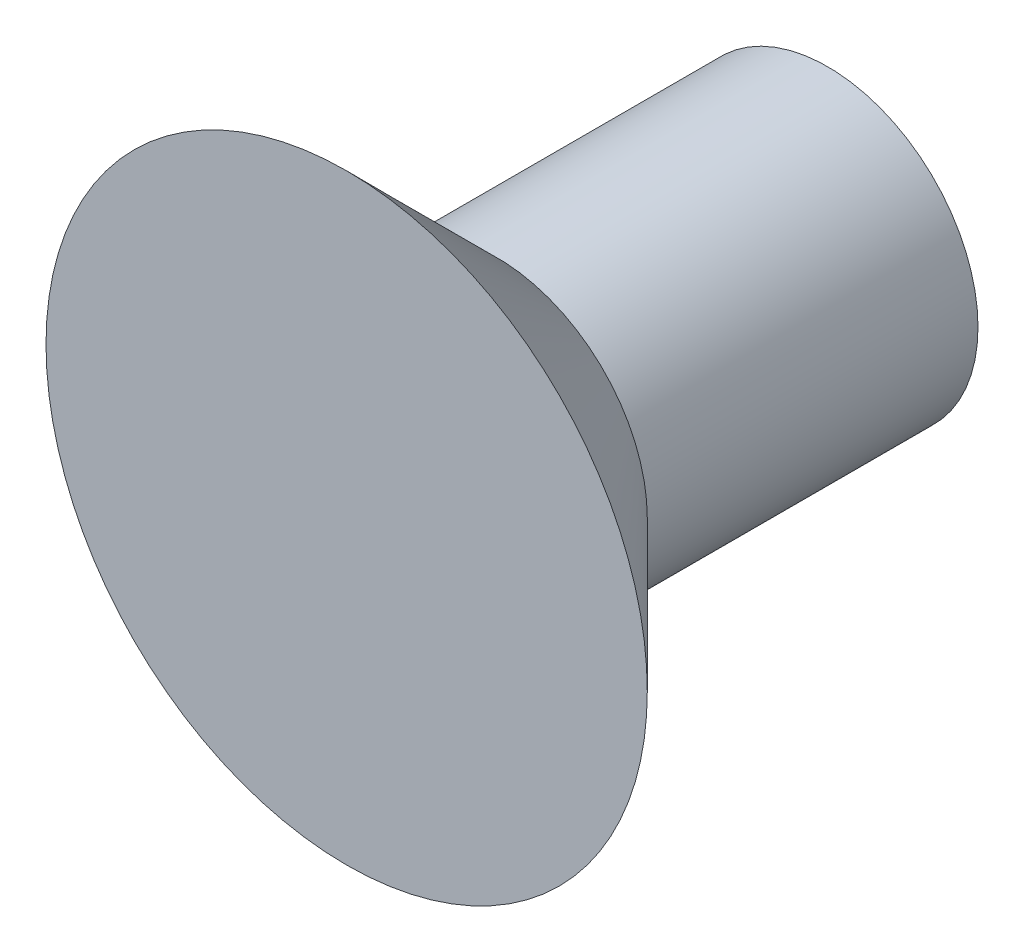
ISO-10303-21;
HEADER;
FILE_DESCRIPTION(('STEP AP214'),'2;1');
FILE_NAME('part.step','',(''),(''),'','','');
FILE_SCHEMA(('AUTOMOTIVE_DESIGN { 1 0 10303 214 1 1 1 1 }'));
ENDSEC;
DATA;
#1=APPLICATION_CONTEXT('core data for automotive mechanical design processes');
#2=APPLICATION_PROTOCOL_DEFINITION('international standard','automotive_design',2000,#1);
#3=PRODUCT_CONTEXT('',#1,'mechanical');
#4=PRODUCT('Part','Part','',(#3));
#5=PRODUCT_RELATED_PRODUCT_CATEGORY('part','',(#4));
#6=PRODUCT_DEFINITION_FORMATION('','',#4);
#7=PRODUCT_DEFINITION_CONTEXT('part definition',#1,'design');
#8=PRODUCT_DEFINITION('design','',#6,#7);
#9=PRODUCT_DEFINITION_SHAPE('','',#8);
#10=(LENGTH_UNIT() NAMED_UNIT(*) SI_UNIT(.MILLI.,.METRE.));
#11=(NAMED_UNIT(*) PLANE_ANGLE_UNIT() SI_UNIT($,.RADIAN.));
#12=(NAMED_UNIT(*) SI_UNIT($,.STERADIAN.) SOLID_ANGLE_UNIT());
#13=UNCERTAINTY_MEASURE_WITH_UNIT(LENGTH_MEASURE(1.E-05),#10,'distance_accuracy_value','');
#14=(GEOMETRIC_REPRESENTATION_CONTEXT(3) GLOBAL_UNCERTAINTY_ASSIGNED_CONTEXT((#13)) GLOBAL_UNIT_ASSIGNED_CONTEXT((#10,
#11,#12)) REPRESENTATION_CONTEXT('',''));
#15=CARTESIAN_POINT('',(0.,0.,0.));
#16=DIRECTION('',(0.,0.,1.));
#17=DIRECTION('',(1.,0.,0.));
#18=AXIS2_PLACEMENT_3D('',#15,#16,#17);
#19=CARTESIAN_POINT('',(0.,0.,0.));
#20=DIRECTION('',(0.,0.,1.));
#21=DIRECTION('',(1.,0.,0.));
#22=AXIS2_PLACEMENT_3D('',#19,#20,#21);
#23=CONICAL_SURFACE('',#22,2.5,0.785398163397448);
#24=CARTESIAN_POINT('',(0.,0.,-1.25));
#25=DIRECTION('',(0.,0.,1.));
#26=DIRECTION('',(1.,0.,0.));
#27=AXIS2_PLACEMENT_3D('',#24,#25,#26);
#28=CIRCLE('',#27,1.25);
#29=CARTESIAN_POINT('',(1.25,0.,-1.25));
#30=VERTEX_POINT('',#29);
#31=EDGE_CURVE('E43',#30,#30,#28,.T.);
#32=ORIENTED_EDGE('',*,*,#31,.T.);
#33=EDGE_LOOP('',(#32));
#34=FACE_BOUND('',#33,.T.);
#35=CARTESIAN_POINT('',(0.,0.,0.));
#36=DIRECTION('',(0.,0.,1.));
#37=DIRECTION('',(1.,0.,0.));
#38=AXIS2_PLACEMENT_3D('',#35,#36,#37);
#39=CIRCLE('',#38,2.5);
#40=CARTESIAN_POINT('',(2.5,0.,0.));
#41=VERTEX_POINT('',#40);
#42=EDGE_CURVE('E10',#41,#41,#39,.T.);
#43=ORIENTED_EDGE('',*,*,#42,.F.);
#44=EDGE_LOOP('',(#43));
#45=FACE_BOUND('',#44,.T.);
#46=ADVANCED_FACE('F40',(#34,#45),#23,.T.);
#47=CARTESIAN_POINT('',(0.,0.,0.));
#48=DIRECTION('',(0.,0.,1.));
#49=DIRECTION('',(1.,0.,0.));
#50=AXIS2_PLACEMENT_3D('',#47,#48,#49);
#51=PLANE('',#50);
#52=ORIENTED_EDGE('',*,*,#42,.T.);
#53=EDGE_LOOP('',(#52));
#54=FACE_BOUND('',#53,.T.);
#55=ADVANCED_FACE('F62',(#54),#51,.T.);
#56=CARTESIAN_POINT('',(0.,0.,-1.25));
#57=DIRECTION('',(0.,0.,-1.));
#58=DIRECTION('',(-1.,0.,0.));
#59=AXIS2_PLACEMENT_3D('',#56,#57,#58);
#60=CYLINDRICAL_SURFACE('',#59,1.25);
#61=ORIENTED_EDGE('',*,*,#31,.F.);
#62=EDGE_LOOP('',(#61));
#63=FACE_BOUND('',#62,.T.);
#64=CARTESIAN_POINT('',(0.,0.,-4.));
#65=DIRECTION('',(0.,0.,1.));
#66=DIRECTION('',(1.,0.,0.));
#67=AXIS2_PLACEMENT_3D('',#64,#65,#66);
#68=CIRCLE('',#67,1.25);
#69=CARTESIAN_POINT('',(1.25,0.,-4.));
#70=VERTEX_POINT('',#69);
#71=EDGE_CURVE('E50',#70,#70,#68,.T.);
#72=ORIENTED_EDGE('',*,*,#71,.T.);
#73=EDGE_LOOP('',(#72));
#74=FACE_BOUND('',#73,.T.);
#75=ADVANCED_FACE('F53',(#63,#74),#60,.T.);
#76=CARTESIAN_POINT('',(0.,0.,-4.));
#77=DIRECTION('',(0.,0.,1.));
#78=DIRECTION('',(1.,0.,0.));
#79=AXIS2_PLACEMENT_3D('',#76,#77,#78);
#80=PLANE('',#79);
#81=ORIENTED_EDGE('',*,*,#71,.F.);
#82=EDGE_LOOP('',(#81));
#83=FACE_BOUND('',#82,.T.);
#84=ADVANCED_FACE('F57',(#83),#80,.F.);
#85=CLOSED_SHELL('',(#46,#55,#75,#84));
#86=MANIFOLD_SOLID_BREP('B2',#85);
#87=ADVANCED_BREP_SHAPE_REPRESENTATION('',(#18,#86),#14);
#88=SHAPE_DEFINITION_REPRESENTATION(#9,#87);
ENDSEC;
END-ISO-10303-21;
